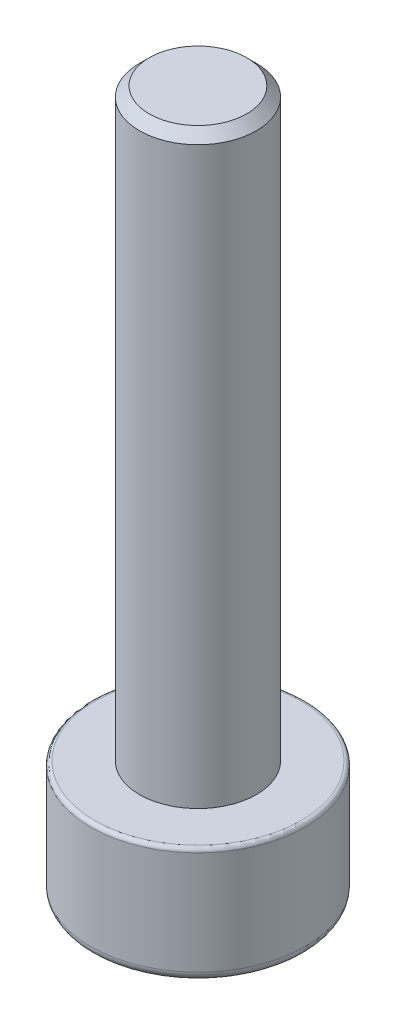
ISO-10303-21;
HEADER;
FILE_DESCRIPTION(('STEP AP214'),'2;1');
FILE_NAME('part.step','',(''),(''),'','','');
FILE_SCHEMA(('AUTOMOTIVE_DESIGN { 1 0 10303 214 1 1 1 1 }'));
ENDSEC;
DATA;
#1=APPLICATION_CONTEXT('core data for automotive mechanical design processes');
#2=APPLICATION_PROTOCOL_DEFINITION('international standard','automotive_design',2000,#1);
#3=PRODUCT_CONTEXT('',#1,'mechanical');
#4=PRODUCT('Part','Part','',(#3));
#5=PRODUCT_RELATED_PRODUCT_CATEGORY('part','',(#4));
#6=PRODUCT_DEFINITION_FORMATION('','',#4);
#7=PRODUCT_DEFINITION_CONTEXT('part definition',#1,'design');
#8=PRODUCT_DEFINITION('design','',#6,#7);
#9=PRODUCT_DEFINITION_SHAPE('','',#8);
#10=(LENGTH_UNIT() NAMED_UNIT(*) SI_UNIT(.MILLI.,.METRE.));
#11=(NAMED_UNIT(*) PLANE_ANGLE_UNIT() SI_UNIT($,.RADIAN.));
#12=(NAMED_UNIT(*) SI_UNIT($,.STERADIAN.) SOLID_ANGLE_UNIT());
#13=UNCERTAINTY_MEASURE_WITH_UNIT(LENGTH_MEASURE(1.E-05),#10,'distance_accuracy_value','');
#14=(GEOMETRIC_REPRESENTATION_CONTEXT(3) GLOBAL_UNCERTAINTY_ASSIGNED_CONTEXT((#13)) GLOBAL_UNIT_ASSIGNED_CONTEXT((#10,
#11,#12)) REPRESENTATION_CONTEXT('',''));
#15=CARTESIAN_POINT('',(0.,0.,0.));
#16=DIRECTION('',(0.,0.,1.));
#17=DIRECTION('',(1.,0.,0.));
#18=AXIS2_PLACEMENT_3D('',#15,#16,#17);
#19=CARTESIAN_POINT('',(0.,3.,0.));
#20=DIRECTION('',(0.,-1.,0.));
#21=DIRECTION('',(0.,0.,-1.));
#22=AXIS2_PLACEMENT_3D('',#19,#20,#21);
#23=CYLINDRICAL_SURFACE('',#22,2.75);
#24=CARTESIAN_POINT('',(0.,2.9,0.));
#25=DIRECTION('',(0.,1.,0.));
#26=DIRECTION('',(0.,0.,1.));
#27=AXIS2_PLACEMENT_3D('',#24,#25,#26);
#28=CIRCLE('',#27,2.75);
#29=CARTESIAN_POINT('',(0.,2.9,2.75));
#30=VERTEX_POINT('',#29);
#31=EDGE_CURVE('E11',#30,#30,#28,.F.);
#32=ORIENTED_EDGE('',*,*,#31,.T.);
#33=EDGE_LOOP('',(#32));
#34=FACE_BOUND('',#33,.T.);
#35=CARTESIAN_POINT('',(0.,0.25,0.));
#36=DIRECTION('',(0.,1.,0.));
#37=DIRECTION('',(0.,0.,1.));
#38=AXIS2_PLACEMENT_3D('',#35,#36,#37);
#39=CIRCLE('',#38,2.75);
#40=CARTESIAN_POINT('',(0.,0.25,2.75));
#41=VERTEX_POINT('',#40);
#42=EDGE_CURVE('E177',#41,#41,#39,.T.);
#43=ORIENTED_EDGE('',*,*,#42,.T.);
#44=EDGE_LOOP('',(#43));
#45=FACE_BOUND('',#44,.T.);
#46=ADVANCED_FACE('F33',(#34,#45),#23,.T.);
#47=CARTESIAN_POINT('',(0.,3.,0.));
#48=DIRECTION('',(0.,1.,0.));
#49=DIRECTION('',(0.,0.,1.));
#50=AXIS2_PLACEMENT_3D('',#47,#48,#49);
#51=PLANE('',#50);
#52=CARTESIAN_POINT('',(0.,3.,0.));
#53=DIRECTION('',(0.,1.,0.));
#54=DIRECTION('',(0.,0.,1.));
#55=AXIS2_PLACEMENT_3D('',#52,#53,#54);
#56=CIRCLE('',#55,2.65);
#57=CARTESIAN_POINT('',(0.,3.,2.65));
#58=VERTEX_POINT('',#57);
#59=EDGE_CURVE('E41',#58,#58,#56,.T.);
#60=ORIENTED_EDGE('',*,*,#59,.T.);
#61=EDGE_LOOP('',(#60));
#62=FACE_BOUND('',#61,.T.);
#63=CARTESIAN_POINT('',(0.,3.,0.));
#64=DIRECTION('',(0.,1.,0.));
#65=DIRECTION('',(0.,0.,1.));
#66=AXIS2_PLACEMENT_3D('',#63,#64,#65);
#67=CIRCLE('',#66,1.5);
#68=CARTESIAN_POINT('',(0.,3.,1.5));
#69=VERTEX_POINT('',#68);
#70=EDGE_CURVE('E141',#69,#69,#67,.T.);
#71=ORIENTED_EDGE('',*,*,#70,.F.);
#72=EDGE_LOOP('',(#71));
#73=FACE_BOUND('',#72,.T.);
#74=ADVANCED_FACE('F203',(#62,#73),#51,.T.);
#75=CARTESIAN_POINT('',(0.,0.,0.));
#76=DIRECTION('',(0.,1.,0.));
#77=DIRECTION('',(0.,0.,1.));
#78=AXIS2_PLACEMENT_3D('',#75,#76,#77);
#79=PLANE('',#78);
#80=CARTESIAN_POINT('',(0.,0.,0.));
#81=DIRECTION('',(0.,1.,0.));
#82=DIRECTION('',(0.,0.,1.));
#83=AXIS2_PLACEMENT_3D('',#80,#81,#82);
#84=CIRCLE('',#83,2.5);
#85=CARTESIAN_POINT('',(0.,0.,2.5));
#86=VERTEX_POINT('',#85);
#87=EDGE_CURVE('E192',#86,#86,#84,.F.);
#88=ORIENTED_EDGE('',*,*,#87,.T.);
#89=EDGE_LOOP('',(#88));
#90=FACE_BOUND('',#89,.T.);
#91=DIRECTION('',(-0.69197693122312,0.,-0.721919612321922));
#92=VECTOR('',#91,1.);
#93=CARTESIAN_POINT('',(1.02450088015783,0.,-0.982008194523005));
#94=LINE('',#93,#92);
#95=CARTESIAN_POINT('',(1.5914635756121,0.,-0.390512335578875));
#96=VERTEX_POINT('',#95);
#97=CARTESIAN_POINT('',(0.457538184703551,0.,-1.57350405346713));
#98=VERTEX_POINT('',#97);
#99=EDGE_CURVE('E156',#96,#98,#94,.T.);
#100=ORIENTED_EDGE('',*,*,#99,.T.);
#101=DIRECTION('',(-0.971189189372558,0.,0.238309795111058));
#102=VECTOR('',#101,1.);
#103=CARTESIAN_POINT('',(-0.338193603102499,0.,-1.3782478856777));
#104=LINE('',#103,#102);
#105=CARTESIAN_POINT('',(-1.13392539090855,0.,-1.18299171788826));
#106=VERTEX_POINT('',#105);
#107=EDGE_CURVE('E166',#98,#106,#104,.T.);
#108=ORIENTED_EDGE('',*,*,#107,.T.);
#109=DIRECTION('',(-0.279212258149438,0.,0.96022940743298));
#110=VECTOR('',#109,1.);
#111=CARTESIAN_POINT('',(-1.36269448326033,0.,-0.396239691154692));
#112=LINE('',#111,#110);
#113=CARTESIAN_POINT('',(-1.5914635756121,0.,0.390512335578874));
#114=VERTEX_POINT('',#113);
#115=EDGE_CURVE('E164',#106,#114,#112,.T.);
#116=ORIENTED_EDGE('',*,*,#115,.T.);
#117=DIRECTION('',(0.69197693122312,0.,0.721919612321922));
#118=VECTOR('',#117,1.);
#119=CARTESIAN_POINT('',(-1.02450088015783,0.,0.982008194523004));
#120=LINE('',#119,#118);
#121=CARTESIAN_POINT('',(-0.457538184703551,0.,1.57350405346713));
#122=VERTEX_POINT('',#121);
#123=EDGE_CURVE('E162',#114,#122,#120,.T.);
#124=ORIENTED_EDGE('',*,*,#123,.T.);
#125=DIRECTION('',(0.971189189372558,0.,-0.238309795111058));
#126=VECTOR('',#125,1.);
#127=CARTESIAN_POINT('',(0.338193603102499,0.,1.3782478856777));
#128=LINE('',#127,#126);
#129=CARTESIAN_POINT('',(1.13392539090855,0.,1.18299171788826));
#130=VERTEX_POINT('',#129);
#131=EDGE_CURVE('E160',#122,#130,#128,.T.);
#132=ORIENTED_EDGE('',*,*,#131,.T.);
#133=DIRECTION('',(0.279212258149438,0.,-0.96022940743298));
#134=VECTOR('',#133,1.);
#135=CARTESIAN_POINT('',(1.36269448326033,0.,0.396239691154693));
#136=LINE('',#135,#134);
#137=EDGE_CURVE('E158',#130,#96,#136,.T.);
#138=ORIENTED_EDGE('',*,*,#137,.T.);
#139=EDGE_LOOP('',(#100,#108,#116,#124,#132,#138));
#140=FACE_BOUND('',#139,.T.);
#141=ADVANCED_FACE('F221',(#90,#140),#79,.F.);
#142=CARTESIAN_POINT('',(0.,18.,0.));
#143=DIRECTION('',(0.,-1.,0.));
#144=DIRECTION('',(0.,0.,-1.));
#145=AXIS2_PLACEMENT_3D('',#142,#143,#144);
#146=CYLINDRICAL_SURFACE('',#145,1.5);
#147=CARTESIAN_POINT('',(0.,17.75,0.));
#148=DIRECTION('',(0.,1.,0.));
#149=DIRECTION('',(0.,0.,1.));
#150=AXIS2_PLACEMENT_3D('',#147,#148,#149);
#151=CIRCLE('',#150,1.5);
#152=CARTESIAN_POINT('',(0.,17.75,1.5));
#153=VERTEX_POINT('',#152);
#154=EDGE_CURVE('E198',#153,#153,#151,.F.);
#155=ORIENTED_EDGE('',*,*,#154,.T.);
#156=EDGE_LOOP('',(#155));
#157=FACE_BOUND('',#156,.T.);
#158=ORIENTED_EDGE('',*,*,#70,.T.);
#159=EDGE_LOOP('',(#158));
#160=FACE_BOUND('',#159,.T.);
#161=ADVANCED_FACE('F260',(#157,#160),#146,.T.);
#162=CARTESIAN_POINT('',(0.,18.,0.));
#163=DIRECTION('',(0.,1.,0.));
#164=DIRECTION('',(0.,0.,1.));
#165=AXIS2_PLACEMENT_3D('',#162,#163,#164);
#166=PLANE('',#165);
#167=CARTESIAN_POINT('',(0.,18.,0.));
#168=DIRECTION('',(0.,1.,0.));
#169=DIRECTION('',(0.,0.,1.));
#170=AXIS2_PLACEMENT_3D('',#167,#168,#169);
#171=CIRCLE('',#170,1.25);
#172=CARTESIAN_POINT('',(0.,18.,1.25));
#173=VERTEX_POINT('',#172);
#174=EDGE_CURVE('E195',#173,#173,#171,.T.);
#175=ORIENTED_EDGE('',*,*,#174,.T.);
#176=EDGE_LOOP('',(#175));
#177=FACE_BOUND('',#176,.T.);
#178=ADVANCED_FACE('F299',(#177),#166,.T.);
#179=CARTESIAN_POINT('',(1.31110540565295,1.5,-0.321718223399928));
#180=DIRECTION('',(0.96022940743298,0.,0.279212258149438));
#181=DIRECTION('',(0.279212258149438,0.,-0.96022940743298));
#182=AXIS2_PLACEMENT_3D('',#179,#180,#181);
#183=PLANE('',#182);
#184=DIRECTION('',(0.,-1.,0.));
#185=VECTOR('',#184,1.);
#186=CARTESIAN_POINT('',(1.31110540565295,1.5,-0.321718223399928));
#187=LINE('',#186,#185);
#188=CARTESIAN_POINT('',(1.31110540565295,1.5,-0.321718223399928));
#189=VERTEX_POINT('',#188);
#190=CARTESIAN_POINT('',(1.31110540565295,0.249999999999999,-0.321718223399928));
#191=VERTEX_POINT('',#190);
#192=EDGE_CURVE('E139',#189,#191,#187,.T.);
#193=ORIENTED_EDGE('',*,*,#192,.T.);
#194=DIRECTION('',(-0.279212258149438,0.,0.96022940743298));
#195=VECTOR('',#194,1.);
#196=CARTESIAN_POINT('',(1.31110540565295,0.249999999999999,-0.321718223399928));
#197=LINE('',#196,#195);
#198=CARTESIAN_POINT('',(0.934168857151212,0.249999999999999,0.974591476634595));
#199=VERTEX_POINT('',#198);
#200=EDGE_CURVE('E55',#191,#199,#197,.T.);
#201=ORIENTED_EDGE('',*,*,#200,.T.);
#202=DIRECTION('',(0.,-1.,0.));
#203=VECTOR('',#202,1.);
#204=CARTESIAN_POINT('',(0.934168857151212,1.5,0.974591476634595));
#205=LINE('',#204,#203);
#206=CARTESIAN_POINT('',(0.934168857151212,1.5,0.974591476634595));
#207=VERTEX_POINT('',#206);
#208=EDGE_CURVE('E103',#207,#199,#205,.T.);
#209=ORIENTED_EDGE('',*,*,#208,.F.);
#210=DIRECTION('',(-0.279212258149438,0.,0.96022940743298));
#211=VECTOR('',#210,1.);
#212=CARTESIAN_POINT('',(1.31110540565295,1.5,-0.321718223399928));
#213=LINE('',#212,#211);
#214=EDGE_CURVE('E107',#189,#207,#213,.T.);
#215=ORIENTED_EDGE('',*,*,#214,.F.);
#216=EDGE_LOOP('',(#193,#201,#209,#215));
#217=FACE_BOUND('',#216,.T.);
#218=ADVANCED_FACE('F105',(#217),#183,.F.);
#219=CARTESIAN_POINT('',(0.376936548501741,1.5,-1.29630970003452));
#220=DIRECTION('',(0.721919612321922,0.,-0.69197693122312));
#221=DIRECTION('',(-0.69197693122312,0.,-0.721919612321922));
#222=AXIS2_PLACEMENT_3D('',#219,#220,#221);
#223=PLANE('',#222);
#224=DIRECTION('',(0.,-1.,0.));
#225=VECTOR('',#224,1.);
#226=CARTESIAN_POINT('',(0.376936548501741,1.5,-1.29630970003452));
#227=LINE('',#226,#225);
#228=CARTESIAN_POINT('',(0.376936548501741,1.5,-1.29630970003452));
#229=VERTEX_POINT('',#228);
#230=CARTESIAN_POINT('',(0.376936548501741,0.249999999999999,-1.29630970003452));
#231=VERTEX_POINT('',#230);
#232=EDGE_CURVE('E142',#229,#231,#227,.T.);
#233=ORIENTED_EDGE('',*,*,#232,.T.);
#234=DIRECTION('',(0.69197693122312,0.,0.721919612321922));
#235=VECTOR('',#234,1.);
#236=CARTESIAN_POINT('',(0.376936548501741,0.249999999999999,-1.29630970003452));
#237=LINE('',#236,#235);
#238=EDGE_CURVE('E48',#231,#191,#237,.T.);
#239=ORIENTED_EDGE('',*,*,#238,.T.);
#240=ORIENTED_EDGE('',*,*,#192,.F.);
#241=DIRECTION('',(0.69197693122312,0.,0.721919612321922));
#242=VECTOR('',#241,1.);
#243=CARTESIAN_POINT('',(0.376936548501741,1.5,-1.29630970003452));
#244=LINE('',#243,#242);
#245=EDGE_CURVE('E112',#229,#189,#244,.T.);
#246=ORIENTED_EDGE('',*,*,#245,.F.);
#247=EDGE_LOOP('',(#233,#239,#240,#246));
#248=FACE_BOUND('',#247,.T.);
#249=ADVANCED_FACE('F272',(#248),#223,.F.);
#250=CARTESIAN_POINT('',(-0.934168857151211,1.5,-0.974591476634595));
#251=DIRECTION('',(-0.238309795111058,0.,-0.971189189372557));
#252=DIRECTION('',(-0.971189189372558,0.,0.238309795111058));
#253=AXIS2_PLACEMENT_3D('',#250,#251,#252);
#254=PLANE('',#253);
#255=DIRECTION('',(0.,-1.,0.));
#256=VECTOR('',#255,1.);
#257=CARTESIAN_POINT('',(-0.934168857151211,1.5,-0.974591476634595));
#258=LINE('',#257,#256);
#259=CARTESIAN_POINT('',(-0.934168857151211,1.5,-0.974591476634595));
#260=VERTEX_POINT('',#259);
#261=CARTESIAN_POINT('',(-0.934168857151211,0.249999999999999,-0.974591476634595));
#262=VERTEX_POINT('',#261);
#263=EDGE_CURVE('E144',#260,#262,#258,.T.);
#264=ORIENTED_EDGE('',*,*,#263,.T.);
#265=DIRECTION('',(0.971189189372558,0.,-0.238309795111058));
#266=VECTOR('',#265,1.);
#267=CARTESIAN_POINT('',(-0.934168857151211,0.249999999999999,-0.974591476634595));
#268=LINE('',#267,#266);
#269=EDGE_CURVE('E153',#262,#231,#268,.T.);
#270=ORIENTED_EDGE('',*,*,#269,.T.);
#271=ORIENTED_EDGE('',*,*,#232,.F.);
#272=DIRECTION('',(0.971189189372558,0.,-0.238309795111058));
#273=VECTOR('',#272,1.);
#274=CARTESIAN_POINT('',(-0.934168857151211,1.5,-0.974591476634595));
#275=LINE('',#274,#273);
#276=EDGE_CURVE('E136',#260,#229,#275,.T.);
#277=ORIENTED_EDGE('',*,*,#276,.F.);
#278=EDGE_LOOP('',(#264,#270,#271,#277));
#279=FACE_BOUND('',#278,.T.);
#280=ADVANCED_FACE('F270',(#279),#254,.F.);
#281=CARTESIAN_POINT('',(-1.31110540565295,1.5,0.321718223399928));
#282=DIRECTION('',(-0.96022940743298,0.,-0.279212258149438));
#283=DIRECTION('',(-0.279212258149438,0.,0.96022940743298));
#284=AXIS2_PLACEMENT_3D('',#281,#282,#283);
#285=PLANE('',#284);
#286=DIRECTION('',(0.,-1.,0.));
#287=VECTOR('',#286,1.);
#288=CARTESIAN_POINT('',(-1.31110540565295,1.5,0.321718223399928));
#289=LINE('',#288,#287);
#290=CARTESIAN_POINT('',(-1.31110540565295,1.5,0.321718223399928));
#291=VERTEX_POINT('',#290);
#292=CARTESIAN_POINT('',(-1.31110540565295,0.249999999999999,0.321718223399928));
#293=VERTEX_POINT('',#292);
#294=EDGE_CURVE('E147',#291,#293,#289,.T.);
#295=ORIENTED_EDGE('',*,*,#294,.T.);
#296=DIRECTION('',(0.279212258149438,0.,-0.96022940743298));
#297=VECTOR('',#296,1.);
#298=CARTESIAN_POINT('',(-1.31110540565295,0.249999999999999,0.321718223399928));
#299=LINE('',#298,#297);
#300=EDGE_CURVE('E169',#293,#262,#299,.T.);
#301=ORIENTED_EDGE('',*,*,#300,.T.);
#302=ORIENTED_EDGE('',*,*,#263,.F.);
#303=DIRECTION('',(0.279212258149438,0.,-0.96022940743298));
#304=VECTOR('',#303,1.);
#305=CARTESIAN_POINT('',(-1.31110540565295,1.5,0.321718223399928));
#306=LINE('',#305,#304);
#307=EDGE_CURVE('E133',#291,#260,#306,.T.);
#308=ORIENTED_EDGE('',*,*,#307,.F.);
#309=EDGE_LOOP('',(#295,#301,#302,#308));
#310=FACE_BOUND('',#309,.T.);
#311=ADVANCED_FACE('F281',(#310),#285,.F.);
#312=CARTESIAN_POINT('',(-0.376936548501741,1.5,1.29630970003452));
#313=DIRECTION('',(-0.721919612321922,0.,0.69197693122312));
#314=DIRECTION('',(0.69197693122312,0.,0.721919612321922));
#315=AXIS2_PLACEMENT_3D('',#312,#313,#314);
#316=PLANE('',#315);
#317=DIRECTION('',(0.,-1.,0.));
#318=VECTOR('',#317,1.);
#319=CARTESIAN_POINT('',(-0.376936548501741,1.5,1.29630970003452));
#320=LINE('',#319,#318);
#321=CARTESIAN_POINT('',(-0.376936548501741,1.5,1.29630970003452));
#322=VERTEX_POINT('',#321);
#323=CARTESIAN_POINT('',(-0.376936548501741,0.249999999999999,1.29630970003452));
#324=VERTEX_POINT('',#323);
#325=EDGE_CURVE('E111',#322,#324,#320,.T.);
#326=ORIENTED_EDGE('',*,*,#325,.T.);
#327=DIRECTION('',(-0.69197693122312,0.,-0.721919612321922));
#328=VECTOR('',#327,1.);
#329=CARTESIAN_POINT('',(-0.376936548501741,0.249999999999999,1.29630970003452));
#330=LINE('',#329,#328);
#331=EDGE_CURVE('E171',#324,#293,#330,.T.);
#332=ORIENTED_EDGE('',*,*,#331,.T.);
#333=ORIENTED_EDGE('',*,*,#294,.F.);
#334=DIRECTION('',(-0.69197693122312,0.,-0.721919612321922));
#335=VECTOR('',#334,1.);
#336=CARTESIAN_POINT('',(-0.376936548501741,1.5,1.29630970003452));
#337=LINE('',#336,#335);
#338=EDGE_CURVE('E121',#322,#291,#337,.T.);
#339=ORIENTED_EDGE('',*,*,#338,.F.);
#340=EDGE_LOOP('',(#326,#332,#333,#339));
#341=FACE_BOUND('',#340,.T.);
#342=ADVANCED_FACE('F278',(#341),#316,.F.);
#343=CARTESIAN_POINT('',(0.934168857151212,1.5,0.974591476634595));
#344=DIRECTION('',(0.238309795111058,0.,0.971189189372558));
#345=DIRECTION('',(0.971189189372558,0.,-0.238309795111058));
#346=AXIS2_PLACEMENT_3D('',#343,#344,#345);
#347=PLANE('',#346);
#348=ORIENTED_EDGE('',*,*,#208,.T.);
#349=DIRECTION('',(-0.971189189372558,0.,0.238309795111058));
#350=VECTOR('',#349,1.);
#351=CARTESIAN_POINT('',(0.934168857151212,0.249999999999999,0.974591476634595));
#352=LINE('',#351,#350);
#353=EDGE_CURVE('E173',#199,#324,#352,.T.);
#354=ORIENTED_EDGE('',*,*,#353,.T.);
#355=ORIENTED_EDGE('',*,*,#325,.F.);
#356=DIRECTION('',(-0.971189189372557,0.,0.238309795111058));
#357=VECTOR('',#356,1.);
#358=CARTESIAN_POINT('',(0.934168857151212,1.5,0.974591476634595));
#359=LINE('',#358,#357);
#360=EDGE_CURVE('E115',#207,#322,#359,.T.);
#361=ORIENTED_EDGE('',*,*,#360,.F.);
#362=EDGE_LOOP('',(#348,#354,#355,#361));
#363=FACE_BOUND('',#362,.T.);
#364=ADVANCED_FACE('F116',(#363),#347,.F.);
#365=CARTESIAN_POINT('',(0.,1.5,0.));
#366=DIRECTION('',(0.,-1.,0.));
#367=DIRECTION('',(0.,0.,-1.));
#368=AXIS2_PLACEMENT_3D('',#365,#366,#367);
#369=PLANE('',#368);
#370=ORIENTED_EDGE('',*,*,#214,.T.);
#371=ORIENTED_EDGE('',*,*,#360,.T.);
#372=ORIENTED_EDGE('',*,*,#338,.T.);
#373=ORIENTED_EDGE('',*,*,#307,.T.);
#374=ORIENTED_EDGE('',*,*,#276,.T.);
#375=ORIENTED_EDGE('',*,*,#245,.T.);
#376=EDGE_LOOP('',(#370,#371,#372,#373,#374,#375));
#377=FACE_BOUND('',#376,.T.);
#378=ADVANCED_FACE('F123',(#377),#369,.T.);
#379=CARTESIAN_POINT('',(0.934168857151212,0.249999999999999,0.974591476634595));
#380=DIRECTION('',(0.168510472146206,0.707106781186547,0.686734461620402));
#381=DIRECTION('',(-0.971189189372558,0.,0.238309795111058));
#382=AXIS2_PLACEMENT_3D('',#379,#380,#381);
#383=PLANE('',#382);
#384=DIRECTION('',(-0.523085392288578,0.654653670707977,-0.545719931652561));
#385=VECTOR('',#384,1.);
#386=CARTESIAN_POINT('',(0.934168857151212,0.249999999999999,0.974591476634595));
#387=LINE('',#386,#385);
#388=EDGE_CURVE('E129',#130,#199,#387,.T.);
#389=ORIENTED_EDGE('',*,*,#388,.F.);
#390=ORIENTED_EDGE('',*,*,#131,.F.);
#391=DIRECTION('',(0.211064628018337,0.654653670707977,-0.725865203896737));
#392=VECTOR('',#391,1.);
#393=CARTESIAN_POINT('',(-0.376936548501741,0.249999999999999,1.29630970003452));
#394=LINE('',#393,#392);
#395=EDGE_CURVE('E126',#324,#122,#394,.F.);
#396=ORIENTED_EDGE('',*,*,#395,.F.);
#397=ORIENTED_EDGE('',*,*,#353,.F.);
#398=EDGE_LOOP('',(#389,#390,#396,#397));
#399=FACE_BOUND('',#398,.T.);
#400=ADVANCED_FACE('F245',(#399),#383,.F.);
#401=CARTESIAN_POINT('',(-0.376936548501741,0.249999999999999,1.29630970003452));
#402=DIRECTION('',(-0.510474253344395,0.707106781186547,0.489301580492525));
#403=DIRECTION('',(-0.69197693122312,0.,-0.721919612321922));
#404=AXIS2_PLACEMENT_3D('',#401,#402,#403);
#405=PLANE('',#404);
#406=ORIENTED_EDGE('',*,*,#395,.T.);
#407=ORIENTED_EDGE('',*,*,#123,.F.);
#408=DIRECTION('',(0.734150020306915,0.654653670707977,-0.180145272244175));
#409=VECTOR('',#408,1.);
#410=CARTESIAN_POINT('',(-1.31110540565295,0.249999999999999,0.321718223399928));
#411=LINE('',#410,#409);
#412=EDGE_CURVE('E185',#293,#114,#411,.F.);
#413=ORIENTED_EDGE('',*,*,#412,.F.);
#414=ORIENTED_EDGE('',*,*,#331,.F.);
#415=EDGE_LOOP('',(#406,#407,#413,#414));
#416=FACE_BOUND('',#415,.T.);
#417=ADVANCED_FACE('F241',(#416),#405,.F.);
#418=CARTESIAN_POINT('',(1.31110540565295,0.249999999999999,-0.321718223399928));
#419=DIRECTION('',(0.6789847254906,0.707106781186548,0.197432881127876));
#420=DIRECTION('',(-0.279212258149438,0.,0.96022940743298));
#421=AXIS2_PLACEMENT_3D('',#418,#419,#420);
#422=PLANE('',#421);
#423=ORIENTED_EDGE('',*,*,#388,.T.);
#424=ORIENTED_EDGE('',*,*,#200,.F.);
#425=DIRECTION('',(-0.734150020306915,0.654653670707977,0.180145272244175));
#426=VECTOR('',#425,1.);
#427=CARTESIAN_POINT('',(1.31110540565295,0.249999999999999,-0.321718223399928));
#428=LINE('',#427,#426);
#429=EDGE_CURVE('E182',#96,#191,#428,.T.);
#430=ORIENTED_EDGE('',*,*,#429,.F.);
#431=ORIENTED_EDGE('',*,*,#137,.F.);
#432=EDGE_LOOP('',(#423,#424,#430,#431));
#433=FACE_BOUND('',#432,.T.);
#434=ADVANCED_FACE('F237',(#433),#422,.F.);
#435=CARTESIAN_POINT('',(-1.31110540565295,0.249999999999999,0.321718223399928));
#436=DIRECTION('',(-0.6789847254906,0.707106781186548,-0.197432881127876));
#437=DIRECTION('',(0.279212258149438,0.,-0.96022940743298));
#438=AXIS2_PLACEMENT_3D('',#435,#436,#437);
#439=PLANE('',#438);
#440=ORIENTED_EDGE('',*,*,#412,.T.);
#441=ORIENTED_EDGE('',*,*,#115,.F.);
#442=DIRECTION('',(0.523085392288578,0.654653670707977,0.545719931652561));
#443=VECTOR('',#442,1.);
#444=CARTESIAN_POINT('',(-0.934168857151211,0.249999999999999,-0.974591476634595));
#445=LINE('',#444,#443);
#446=EDGE_CURVE('E180',#262,#106,#445,.F.);
#447=ORIENTED_EDGE('',*,*,#446,.F.);
#448=ORIENTED_EDGE('',*,*,#300,.F.);
#449=EDGE_LOOP('',(#440,#441,#447,#448));
#450=FACE_BOUND('',#449,.T.);
#451=ADVANCED_FACE('F233',(#450),#439,.F.);
#452=CARTESIAN_POINT('',(0.376936548501741,0.249999999999999,-1.29630970003452));
#453=DIRECTION('',(0.510474253344394,0.707106781186547,-0.489301580492525));
#454=DIRECTION('',(0.69197693122312,0.,0.721919612321922));
#455=AXIS2_PLACEMENT_3D('',#452,#453,#454);
#456=PLANE('',#455);
#457=ORIENTED_EDGE('',*,*,#429,.T.);
#458=ORIENTED_EDGE('',*,*,#238,.F.);
#459=DIRECTION('',(0.211064628018337,-0.654653670707977,-0.725865203896737));
#460=VECTOR('',#459,1.);
#461=CARTESIAN_POINT('',(0.269240391786958,0.584038370031139,-0.92593550002466));
#462=LINE('',#461,#460);
#463=EDGE_CURVE('E178',#98,#231,#462,.F.);
#464=ORIENTED_EDGE('',*,*,#463,.F.);
#465=ORIENTED_EDGE('',*,*,#99,.F.);
#466=EDGE_LOOP('',(#457,#458,#464,#465));
#467=FACE_BOUND('',#466,.T.);
#468=ADVANCED_FACE('F229',(#467),#456,.F.);
#469=CARTESIAN_POINT('',(-0.934168857151211,0.249999999999999,-0.974591476634595));
#470=DIRECTION('',(-0.168510472146206,0.707106781186547,-0.686734461620402));
#471=DIRECTION('',(0.971189189372558,0.,-0.238309795111058));
#472=AXIS2_PLACEMENT_3D('',#469,#470,#471);
#473=PLANE('',#472);
#474=ORIENTED_EDGE('',*,*,#446,.T.);
#475=ORIENTED_EDGE('',*,*,#107,.F.);
#476=ORIENTED_EDGE('',*,*,#463,.T.);
#477=ORIENTED_EDGE('',*,*,#269,.F.);
#478=EDGE_LOOP('',(#474,#475,#476,#477));
#479=FACE_BOUND('',#478,.T.);
#480=ADVANCED_FACE('F226',(#479),#473,.F.);
#481=CARTESIAN_POINT('',(0.,0.25,0.));
#482=DIRECTION('',(0.,1.,0.));
#483=DIRECTION('',(0.,0.,1.));
#484=AXIS2_PLACEMENT_3D('',#481,#482,#483);
#485=TOROIDAL_SURFACE('',#484,2.5,0.25);
#486=ORIENTED_EDGE('',*,*,#87,.F.);
#487=EDGE_LOOP('',(#486));
#488=FACE_BOUND('',#487,.T.);
#489=ORIENTED_EDGE('',*,*,#42,.F.);
#490=EDGE_LOOP('',(#489));
#491=FACE_BOUND('',#490,.T.);
#492=ADVANCED_FACE('F212',(#488,#491),#485,.T.);
#493=CARTESIAN_POINT('',(0.,18.,0.));
#494=DIRECTION('',(0.,-1.,0.));
#495=DIRECTION('',(0.,0.,-1.));
#496=AXIS2_PLACEMENT_3D('',#493,#494,#495);
#497=CONICAL_SURFACE('',#496,1.25,0.785398163397446);
#498=ORIENTED_EDGE('',*,*,#154,.F.);
#499=EDGE_LOOP('',(#498));
#500=FACE_BOUND('',#499,.T.);
#501=ORIENTED_EDGE('',*,*,#174,.F.);
#502=EDGE_LOOP('',(#501));
#503=FACE_BOUND('',#502,.T.);
#504=ADVANCED_FACE('F207',(#500,#503),#497,.T.);
#505=CARTESIAN_POINT('',(0.,2.9,0.));
#506=DIRECTION('',(0.,1.,0.));
#507=DIRECTION('',(0.,0.,1.));
#508=AXIS2_PLACEMENT_3D('',#505,#506,#507);
#509=TOROIDAL_SURFACE('',#508,2.65,0.1);
#510=ORIENTED_EDGE('',*,*,#31,.F.);
#511=EDGE_LOOP('',(#510));
#512=FACE_BOUND('',#511,.T.);
#513=ORIENTED_EDGE('',*,*,#59,.F.);
#514=EDGE_LOOP('',(#513));
#515=FACE_BOUND('',#514,.T.);
#516=ADVANCED_FACE('F35',(#512,#515),#509,.T.);
#517=CLOSED_SHELL('',(#46,#74,#141,#161,#178,#218,#249,#280,#311,#342,#364,#378,#400,#417,#434,
#451,#468,#480,#492,#504,#516));
#518=MANIFOLD_SOLID_BREP('B2',#517);
#519=ADVANCED_BREP_SHAPE_REPRESENTATION('',(#18,#518),#14);
#520=SHAPE_DEFINITION_REPRESENTATION(#9,#519);
ENDSEC;
END-ISO-10303-21;
